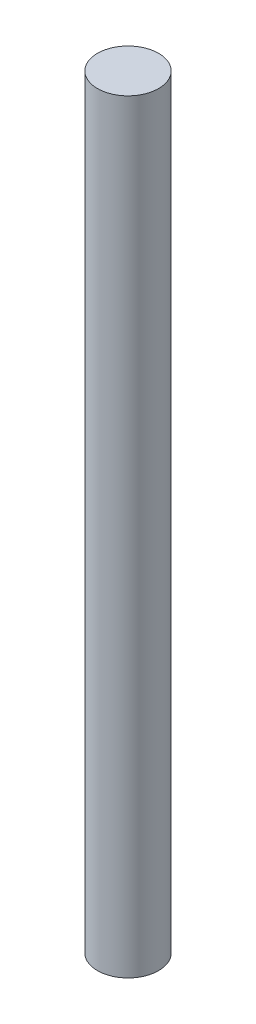
ISO-10303-21;
HEADER;
FILE_DESCRIPTION(('STEP AP214'),'2;1');
FILE_NAME('part.step','',(''),(''),'','','');
FILE_SCHEMA(('AUTOMOTIVE_DESIGN { 1 0 10303 214 1 1 1 1 }'));
ENDSEC;
DATA;
#1=APPLICATION_CONTEXT('core data for automotive mechanical design processes');
#2=APPLICATION_PROTOCOL_DEFINITION('international standard','automotive_design',2000,#1);
#3=PRODUCT_CONTEXT('',#1,'mechanical');
#4=PRODUCT('Part','Part','',(#3));
#5=PRODUCT_RELATED_PRODUCT_CATEGORY('part','',(#4));
#6=PRODUCT_DEFINITION_FORMATION('','',#4);
#7=PRODUCT_DEFINITION_CONTEXT('part definition',#1,'design');
#8=PRODUCT_DEFINITION('design','',#6,#7);
#9=PRODUCT_DEFINITION_SHAPE('','',#8);
#10=(LENGTH_UNIT() NAMED_UNIT(*) SI_UNIT(.MILLI.,.METRE.));
#11=(NAMED_UNIT(*) PLANE_ANGLE_UNIT() SI_UNIT($,.RADIAN.));
#12=(NAMED_UNIT(*) SI_UNIT($,.STERADIAN.) SOLID_ANGLE_UNIT());
#13=UNCERTAINTY_MEASURE_WITH_UNIT(LENGTH_MEASURE(1.E-05),#10,'distance_accuracy_value','');
#14=(GEOMETRIC_REPRESENTATION_CONTEXT(3) GLOBAL_UNCERTAINTY_ASSIGNED_CONTEXT((#13)) GLOBAL_UNIT_ASSIGNED_CONTEXT((#10,
#11,#12)) REPRESENTATION_CONTEXT('',''));
#15=CARTESIAN_POINT('',(0.,0.,0.));
#16=DIRECTION('',(0.,0.,1.));
#17=DIRECTION('',(1.,0.,0.));
#18=AXIS2_PLACEMENT_3D('',#15,#16,#17);
#19=CARTESIAN_POINT('',(0.,158.75,0.));
#20=DIRECTION('',(0.,-1.,0.));
#21=DIRECTION('',(0.,0.,-1.));
#22=AXIS2_PLACEMENT_3D('',#19,#20,#21);
#23=CYLINDRICAL_SURFACE('',#22,6.35);
#24=CARTESIAN_POINT('',(0.,158.75,0.));
#25=DIRECTION('',(0.,1.,0.));
#26=DIRECTION('',(0.,0.,1.));
#27=AXIS2_PLACEMENT_3D('',#24,#25,#26);
#28=CIRCLE('',#27,6.35);
#29=CARTESIAN_POINT('',(0.,158.75,-6.35));
#30=VERTEX_POINT('',#29);
#31=EDGE_CURVE('E10',#30,#30,#28,.T.);
#32=CARTESIAN_POINT('',(0.,0.,0.));
#33=DIRECTION('',(0.,1.,0.));
#34=DIRECTION('',(0.,0.,1.));
#35=AXIS2_PLACEMENT_3D('',#32,#33,#34);
#36=CIRCLE('',#35,6.35);
#37=CARTESIAN_POINT('',(0.,0.,-6.35));
#38=VERTEX_POINT('',#37);
#39=EDGE_CURVE('E37',#38,#38,#36,.T.);
#40=CARTESIAN_POINT('',(0.,158.75,-6.35));
#41=CARTESIAN_POINT('',(0.,157.096354166667,-6.35));
#42=CARTESIAN_POINT('',(0.,155.442708333333,-6.35));
#43=CARTESIAN_POINT('',(0.,152.135416666667,-6.35));
#44=CARTESIAN_POINT('',(0.,150.481770833333,-6.35));
#45=CARTESIAN_POINT('',(0.,147.174479166667,-6.35));
#46=CARTESIAN_POINT('',(0.,145.520833333333,-6.35));
#47=CARTESIAN_POINT('',(0.,142.213541666667,-6.35));
#48=CARTESIAN_POINT('',(0.,140.559895833333,-6.35));
#49=CARTESIAN_POINT('',(0.,137.252604166667,-6.35));
#50=CARTESIAN_POINT('',(0.,135.598958333333,-6.35));
#51=CARTESIAN_POINT('',(0.,132.291666666667,-6.35));
#52=CARTESIAN_POINT('',(0.,130.638020833333,-6.35));
#53=CARTESIAN_POINT('',(0.,127.330729166667,-6.35));
#54=CARTESIAN_POINT('',(0.,125.677083333333,-6.35));
#55=CARTESIAN_POINT('',(0.,122.369791666667,-6.35));
#56=CARTESIAN_POINT('',(0.,120.716145833333,-6.35));
#57=CARTESIAN_POINT('',(0.,117.408854166667,-6.35));
#58=CARTESIAN_POINT('',(0.,115.755208333333,-6.35));
#59=CARTESIAN_POINT('',(0.,112.447916666667,-6.35));
#60=CARTESIAN_POINT('',(0.,110.794270833333,-6.35));
#61=CARTESIAN_POINT('',(0.,107.486979166667,-6.35));
#62=CARTESIAN_POINT('',(0.,105.833333333333,-6.35));
#63=CARTESIAN_POINT('',(0.,102.526041666667,-6.35));
#64=CARTESIAN_POINT('',(0.,100.872395833333,-6.35));
#65=CARTESIAN_POINT('',(0.,97.5651041666667,-6.35));
#66=CARTESIAN_POINT('',(0.,95.9114583333333,-6.35));
#67=CARTESIAN_POINT('',(0.,92.6041666666667,-6.35));
#68=CARTESIAN_POINT('',(0.,90.9505208333333,-6.35));
#69=CARTESIAN_POINT('',(0.,87.6432291666667,-6.35));
#70=CARTESIAN_POINT('',(0.,85.9895833333333,-6.35));
#71=CARTESIAN_POINT('',(0.,82.6822916666667,-6.35));
#72=CARTESIAN_POINT('',(0.,81.0286458333333,-6.35));
#73=CARTESIAN_POINT('',(0.,77.7213541666667,-6.35));
#74=CARTESIAN_POINT('',(0.,76.0677083333333,-6.35));
#75=CARTESIAN_POINT('',(0.,72.7604166666667,-6.35));
#76=CARTESIAN_POINT('',(0.,71.1067708333333,-6.35));
#77=CARTESIAN_POINT('',(0.,67.7994791666666,-6.35));
#78=CARTESIAN_POINT('',(0.,66.1458333333333,-6.35));
#79=CARTESIAN_POINT('',(0.,62.8385416666667,-6.35));
#80=CARTESIAN_POINT('',(0.,61.1848958333333,-6.35));
#81=CARTESIAN_POINT('',(0.,57.8776041666666,-6.35));
#82=CARTESIAN_POINT('',(0.,56.2239583333333,-6.35));
#83=CARTESIAN_POINT('',(0.,52.9166666666667,-6.35));
#84=CARTESIAN_POINT('',(0.,51.2630208333333,-6.35));
#85=CARTESIAN_POINT('',(0.,47.9557291666667,-6.35));
#86=CARTESIAN_POINT('',(0.,46.3020833333333,-6.35));
#87=CARTESIAN_POINT('',(0.,42.9947916666667,-6.35));
#88=CARTESIAN_POINT('',(0.,41.3411458333333,-6.35));
#89=CARTESIAN_POINT('',(0.,38.0338541666667,-6.35));
#90=CARTESIAN_POINT('',(0.,36.3802083333333,-6.35));
#91=CARTESIAN_POINT('',(0.,33.0729166666666,-6.35));
#92=CARTESIAN_POINT('',(0.,31.4192708333333,-6.35));
#93=CARTESIAN_POINT('',(0.,28.1119791666667,-6.35));
#94=CARTESIAN_POINT('',(0.,26.4583333333333,-6.35));
#95=CARTESIAN_POINT('',(0.,23.1510416666666,-6.35));
#96=CARTESIAN_POINT('',(0.,21.4973958333333,-6.35));
#97=CARTESIAN_POINT('',(0.,18.1901041666666,-6.35));
#98=CARTESIAN_POINT('',(0.,16.5364583333333,-6.35));
#99=CARTESIAN_POINT('',(0.,13.2291666666666,-6.35));
#100=CARTESIAN_POINT('',(0.,11.5755208333333,-6.35));
#101=CARTESIAN_POINT('',(0.,8.26822916666664,-6.35));
#102=CARTESIAN_POINT('',(0.,6.61458333333331,-6.35));
#103=CARTESIAN_POINT('',(0.,3.30729166666665,-6.35));
#104=CARTESIAN_POINT('',(0.,1.65364583333331,-6.35));
#105=CARTESIAN_POINT('',(0.,0.,-6.35));
#106=B_SPLINE_CURVE_WITH_KNOTS('',3,(#40,#41,#42,#43,#44,#45,#46,#47,#48,#49,#50,#51,#52,#53,
#54,#55,#56,#57,#58,#59,#60,#61,#62,#63,#64,#65,#66,#67,#68,#69,#70,#71,#72,#73,#74,#75,#76,#77,
#78,#79,#80,#81,#82,#83,#84,#85,#86,#87,#88,#89,#90,#91,#92,#93,#94,#95,#96,#97,#98,#99,#100,
#101,#102,#103,#104,#105),.UNSPECIFIED.,.F.,.F.,(4,2,2,2,2,2,2,2,2,2,2,2,2,2,2,2,2,2,2,2,2,2,2,
2,2,2,2,2,2,2,2,2,4),(0.,4.96093749999998,9.921875,14.8828125,19.84375,24.8046875,29.765625,
34.7265625,39.6875,44.6484375,49.609375,54.5703125,59.53125,64.4921875,69.453125,74.4140625,
79.375,84.3359375,89.296875,94.2578125,99.21875,104.1796875,109.140625,114.1015625,119.0625,
124.0234375,128.984375,133.9453125,138.90625,143.8671875,148.828125,153.7890625,158.75),.UNSPECIFIED.);
#107=EDGE_CURVE('BSEAM34',#30,#38,#106,.T.);
#108=ORIENTED_EDGE('',*,*,#31,.F.);
#109=ORIENTED_EDGE('',*,*,#39,.T.);
#110=ORIENTED_EDGE('',*,*,#107,.T.);
#111=ORIENTED_EDGE('',*,*,#107,.F.);
#112=EDGE_LOOP('',(#108,#110,#109,#111));
#113=FACE_BOUND('',#112,.T.);
#114=ADVANCED_FACE('F34',(#113),#23,.T.);
#115=CARTESIAN_POINT('',(0.,158.75,0.));
#116=DIRECTION('',(0.,1.,0.));
#117=DIRECTION('',(0.,0.,1.));
#118=AXIS2_PLACEMENT_3D('',#115,#116,#117);
#119=PLANE('',#118);
#120=ORIENTED_EDGE('',*,*,#31,.T.);
#121=EDGE_LOOP('',(#120));
#122=FACE_BOUND('',#121,.T.);
#123=ADVANCED_FACE('F49',(#122),#119,.T.);
#124=CARTESIAN_POINT('',(0.,0.,0.));
#125=DIRECTION('',(0.,1.,0.));
#126=DIRECTION('',(0.,0.,1.));
#127=AXIS2_PLACEMENT_3D('',#124,#125,#126);
#128=PLANE('',#127);
#129=ORIENTED_EDGE('',*,*,#39,.F.);
#130=EDGE_LOOP('',(#129));
#131=FACE_BOUND('',#130,.T.);
#132=ADVANCED_FACE('F47',(#131),#128,.F.);
#133=CLOSED_SHELL('',(#114,#123,#132));
#134=MANIFOLD_SOLID_BREP('B2',#133);
#135=ADVANCED_BREP_SHAPE_REPRESENTATION('',(#18,#134),#14);
#136=SHAPE_DEFINITION_REPRESENTATION(#9,#135);
ENDSEC;
END-ISO-10303-21;
